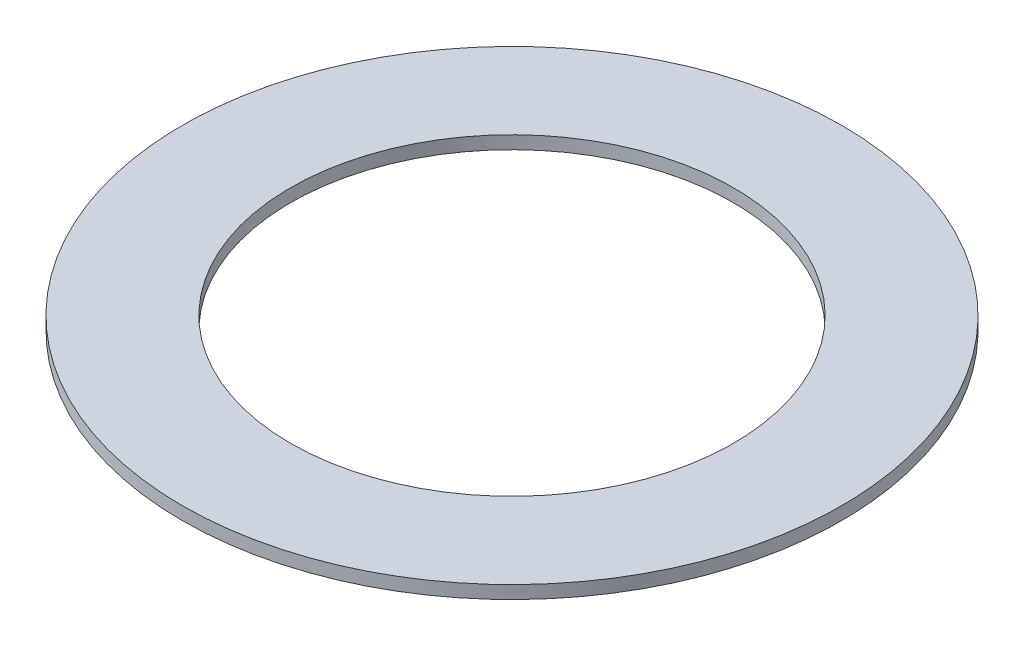
ISO-10303-21;
HEADER;
FILE_DESCRIPTION(('STEP AP214'),'2;1');
FILE_NAME('part.step','',(''),(''),'','','');
FILE_SCHEMA(('AUTOMOTIVE_DESIGN { 1 0 10303 214 1 1 1 1 }'));
ENDSEC;
DATA;
#1=APPLICATION_CONTEXT('core data for automotive mechanical design processes');
#2=APPLICATION_PROTOCOL_DEFINITION('international standard','automotive_design',2000,#1);
#3=PRODUCT_CONTEXT('',#1,'mechanical');
#4=PRODUCT('Part','Part','',(#3));
#5=PRODUCT_RELATED_PRODUCT_CATEGORY('part','',(#4));
#6=PRODUCT_DEFINITION_FORMATION('','',#4);
#7=PRODUCT_DEFINITION_CONTEXT('part definition',#1,'design');
#8=PRODUCT_DEFINITION('design','',#6,#7);
#9=PRODUCT_DEFINITION_SHAPE('','',#8);
#10=(LENGTH_UNIT() NAMED_UNIT(*) SI_UNIT(.MILLI.,.METRE.));
#11=(NAMED_UNIT(*) PLANE_ANGLE_UNIT() SI_UNIT($,.RADIAN.));
#12=(NAMED_UNIT(*) SI_UNIT($,.STERADIAN.) SOLID_ANGLE_UNIT());
#13=UNCERTAINTY_MEASURE_WITH_UNIT(LENGTH_MEASURE(1.E-05),#10,'distance_accuracy_value','');
#14=(GEOMETRIC_REPRESENTATION_CONTEXT(3) GLOBAL_UNCERTAINTY_ASSIGNED_CONTEXT((#13)) GLOBAL_UNIT_ASSIGNED_CONTEXT((#10,
#11,#12)) REPRESENTATION_CONTEXT('',''));
#15=CARTESIAN_POINT('',(0.,0.,0.));
#16=DIRECTION('',(0.,0.,1.));
#17=DIRECTION('',(1.,0.,0.));
#18=AXIS2_PLACEMENT_3D('',#15,#16,#17);
#19=CARTESIAN_POINT('',(0.,-1.5,0.));
#20=DIRECTION('',(0.,1.,0.));
#21=DIRECTION('',(0.,0.,1.));
#22=AXIS2_PLACEMENT_3D('',#19,#20,#21);
#23=CYLINDRICAL_SURFACE('',#22,76.2);
#24=CARTESIAN_POINT('',(0.,-1.5,0.));
#25=DIRECTION('',(0.,1.,0.));
#26=DIRECTION('',(0.,0.,1.));
#27=AXIS2_PLACEMENT_3D('',#24,#25,#26);
#28=CIRCLE('',#27,76.2);
#29=CARTESIAN_POINT('',(0.,-1.5,76.2));
#30=VERTEX_POINT('',#29);
#31=EDGE_CURVE('E10',#30,#30,#28,.T.);
#32=ORIENTED_EDGE('',*,*,#31,.T.);
#33=EDGE_LOOP('',(#32));
#34=FACE_BOUND('',#33,.T.);
#35=CARTESIAN_POINT('',(0.,1.5,0.));
#36=DIRECTION('',(0.,1.,0.));
#37=DIRECTION('',(0.,0.,1.));
#38=AXIS2_PLACEMENT_3D('',#35,#36,#37);
#39=CIRCLE('',#38,76.2);
#40=CARTESIAN_POINT('',(0.,1.5,76.2));
#41=VERTEX_POINT('',#40);
#42=EDGE_CURVE('E50',#41,#41,#39,.T.);
#43=ORIENTED_EDGE('',*,*,#42,.F.);
#44=EDGE_LOOP('',(#43));
#45=FACE_BOUND('',#44,.T.);
#46=ADVANCED_FACE('F38',(#34,#45),#23,.T.);
#47=CARTESIAN_POINT('',(0.,-1.5,0.));
#48=DIRECTION('',(0.,1.,0.));
#49=DIRECTION('',(0.,0.,1.));
#50=AXIS2_PLACEMENT_3D('',#47,#48,#49);
#51=PLANE('',#50);
#52=CARTESIAN_POINT('',(0.,-1.5,0.));
#53=DIRECTION('',(0.,1.,0.));
#54=DIRECTION('',(0.,0.,1.));
#55=AXIS2_PLACEMENT_3D('',#52,#53,#54);
#56=CIRCLE('',#55,51.2);
#57=CARTESIAN_POINT('',(0.,-1.5,51.2));
#58=VERTEX_POINT('',#57);
#59=EDGE_CURVE('E45',#58,#58,#56,.T.);
#60=ORIENTED_EDGE('',*,*,#59,.T.);
#61=EDGE_LOOP('',(#60));
#62=FACE_BOUND('',#61,.T.);
#63=ORIENTED_EDGE('',*,*,#31,.F.);
#64=EDGE_LOOP('',(#63));
#65=FACE_BOUND('',#64,.T.);
#66=ADVANCED_FACE('F71',(#62,#65),#51,.F.);
#67=CARTESIAN_POINT('',(0.,-1.5,0.));
#68=DIRECTION('',(0.,1.,0.));
#69=DIRECTION('',(0.,0.,1.));
#70=AXIS2_PLACEMENT_3D('',#67,#68,#69);
#71=CYLINDRICAL_SURFACE('',#70,51.2);
#72=ORIENTED_EDGE('',*,*,#59,.F.);
#73=EDGE_LOOP('',(#72));
#74=FACE_BOUND('',#73,.T.);
#75=CARTESIAN_POINT('',(0.,1.5,0.));
#76=DIRECTION('',(0.,1.,0.));
#77=DIRECTION('',(0.,0.,1.));
#78=AXIS2_PLACEMENT_3D('',#75,#76,#77);
#79=CIRCLE('',#78,51.2);
#80=CARTESIAN_POINT('',(0.,1.5,51.2));
#81=VERTEX_POINT('',#80);
#82=EDGE_CURVE('E55',#81,#81,#79,.T.);
#83=ORIENTED_EDGE('',*,*,#82,.T.);
#84=EDGE_LOOP('',(#83));
#85=FACE_BOUND('',#84,.T.);
#86=ADVANCED_FACE('F62',(#74,#85),#71,.F.);
#87=CARTESIAN_POINT('',(0.,1.5,0.));
#88=DIRECTION('',(0.,1.,0.));
#89=DIRECTION('',(0.,0.,1.));
#90=AXIS2_PLACEMENT_3D('',#87,#88,#89);
#91=PLANE('',#90);
#92=ORIENTED_EDGE('',*,*,#42,.T.);
#93=EDGE_LOOP('',(#92));
#94=FACE_BOUND('',#93,.T.);
#95=ORIENTED_EDGE('',*,*,#82,.F.);
#96=EDGE_LOOP('',(#95));
#97=FACE_BOUND('',#96,.T.);
#98=ADVANCED_FACE('F64',(#94,#97),#91,.T.);
#99=CLOSED_SHELL('',(#46,#66,#86,#98));
#100=MANIFOLD_SOLID_BREP('B2',#99);
#101=ADVANCED_BREP_SHAPE_REPRESENTATION('',(#18,#100),#14);
#102=SHAPE_DEFINITION_REPRESENTATION(#9,#101);
ENDSEC;
END-ISO-10303-21;
